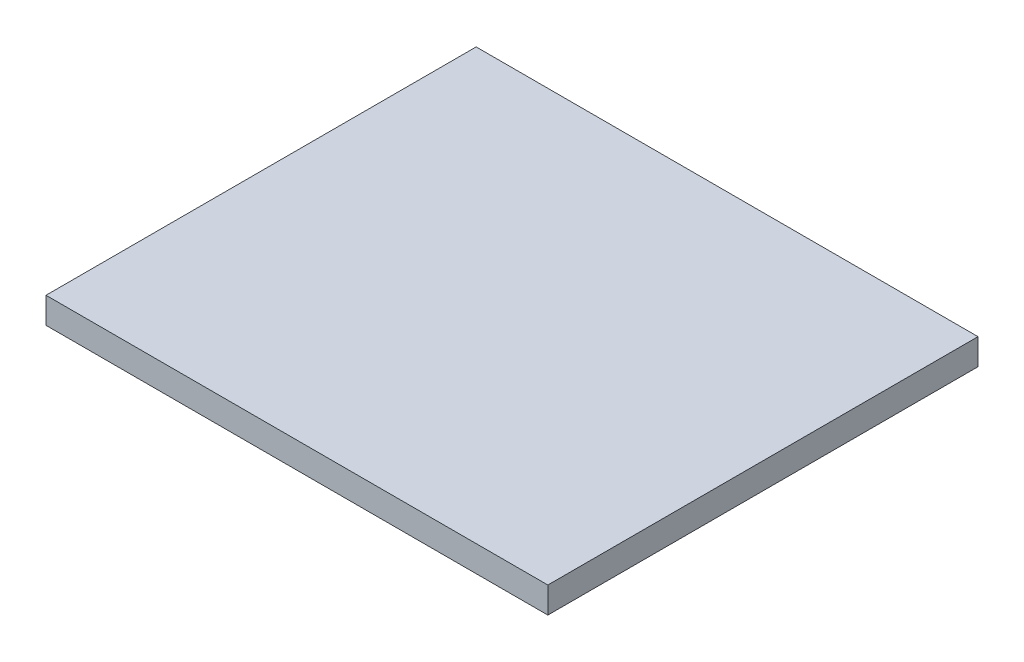
ISO-10303-21;
HEADER;
FILE_DESCRIPTION(('STEP AP214'),'2;1');
FILE_NAME('part.step','',(''),(''),'','','');
FILE_SCHEMA(('AUTOMOTIVE_DESIGN { 1 0 10303 214 1 1 1 1 }'));
ENDSEC;
DATA;
#1=APPLICATION_CONTEXT('core data for automotive mechanical design processes');
#2=APPLICATION_PROTOCOL_DEFINITION('international standard','automotive_design',2000,#1);
#3=PRODUCT_CONTEXT('',#1,'mechanical');
#4=PRODUCT('Part','Part','',(#3));
#5=PRODUCT_RELATED_PRODUCT_CATEGORY('part','',(#4));
#6=PRODUCT_DEFINITION_FORMATION('','',#4);
#7=PRODUCT_DEFINITION_CONTEXT('part definition',#1,'design');
#8=PRODUCT_DEFINITION('design','',#6,#7);
#9=PRODUCT_DEFINITION_SHAPE('','',#8);
#10=(LENGTH_UNIT() NAMED_UNIT(*) SI_UNIT(.MILLI.,.METRE.));
#11=(NAMED_UNIT(*) PLANE_ANGLE_UNIT() SI_UNIT($,.RADIAN.));
#12=(NAMED_UNIT(*) SI_UNIT($,.STERADIAN.) SOLID_ANGLE_UNIT());
#13=UNCERTAINTY_MEASURE_WITH_UNIT(LENGTH_MEASURE(1.E-05),#10,'distance_accuracy_value','');
#14=(GEOMETRIC_REPRESENTATION_CONTEXT(3) GLOBAL_UNCERTAINTY_ASSIGNED_CONTEXT((#13)) GLOBAL_UNIT_ASSIGNED_CONTEXT((#10,
#11,#12)) REPRESENTATION_CONTEXT('',''));
#15=CARTESIAN_POINT('',(0.,0.,0.));
#16=DIRECTION('',(0.,0.,1.));
#17=DIRECTION('',(1.,0.,0.));
#18=AXIS2_PLACEMENT_3D('',#15,#16,#17);
#19=CARTESIAN_POINT('',(19.25,2.,-16.5));
#20=DIRECTION('',(-1.,0.,0.));
#21=DIRECTION('',(0.,0.,1.));
#22=AXIS2_PLACEMENT_3D('',#19,#20,#21);
#23=PLANE('',#22);
#24=DIRECTION('',(0.,0.,-1.));
#25=VECTOR('',#24,1.);
#26=CARTESIAN_POINT('',(19.25,0.,-16.5));
#27=LINE('',#26,#25);
#28=CARTESIAN_POINT('',(19.25,0.,16.5));
#29=VERTEX_POINT('',#28);
#30=CARTESIAN_POINT('',(19.25,0.,-16.5));
#31=VERTEX_POINT('',#30);
#32=EDGE_CURVE('E98',#29,#31,#27,.T.);
#33=ORIENTED_EDGE('',*,*,#32,.T.);
#34=DIRECTION('',(0.,-1.,0.));
#35=VECTOR('',#34,1.);
#36=CARTESIAN_POINT('',(19.25,2.,-16.5));
#37=LINE('',#36,#35);
#38=CARTESIAN_POINT('',(19.25,2.,-16.5));
#39=VERTEX_POINT('',#38);
#40=EDGE_CURVE('E11',#39,#31,#37,.T.);
#41=ORIENTED_EDGE('',*,*,#40,.F.);
#42=DIRECTION('',(0.,0.,-1.));
#43=VECTOR('',#42,1.);
#44=CARTESIAN_POINT('',(19.25,2.,-16.5));
#45=LINE('',#44,#43);
#46=CARTESIAN_POINT('',(19.25,2.,16.5));
#47=VERTEX_POINT('',#46);
#48=EDGE_CURVE('E86',#47,#39,#45,.T.);
#49=ORIENTED_EDGE('',*,*,#48,.F.);
#50=DIRECTION('',(0.,-1.,0.));
#51=VECTOR('',#50,1.);
#52=CARTESIAN_POINT('',(19.25,2.,16.5));
#53=LINE('',#52,#51);
#54=EDGE_CURVE('E94',#47,#29,#53,.T.);
#55=ORIENTED_EDGE('',*,*,#54,.T.);
#56=EDGE_LOOP('',(#33,#41,#49,#55));
#57=FACE_BOUND('',#56,.T.);
#58=ADVANCED_FACE('F35',(#57),#23,.F.);
#59=CARTESIAN_POINT('',(-19.25,2.,-16.5));
#60=DIRECTION('',(0.,0.,1.));
#61=DIRECTION('',(1.,0.,0.));
#62=AXIS2_PLACEMENT_3D('',#59,#60,#61);
#63=PLANE('',#62);
#64=DIRECTION('',(-1.,0.,0.));
#65=VECTOR('',#64,1.);
#66=CARTESIAN_POINT('',(-19.25,0.,-16.5));
#67=LINE('',#66,#65);
#68=CARTESIAN_POINT('',(-19.25,0.,-16.5));
#69=VERTEX_POINT('',#68);
#70=EDGE_CURVE('E90',#31,#69,#67,.T.);
#71=ORIENTED_EDGE('',*,*,#70,.T.);
#72=DIRECTION('',(0.,-1.,0.));
#73=VECTOR('',#72,1.);
#74=CARTESIAN_POINT('',(-19.25,2.,-16.5));
#75=LINE('',#74,#73);
#76=CARTESIAN_POINT('',(-19.25,2.,-16.5));
#77=VERTEX_POINT('',#76);
#78=EDGE_CURVE('E43',#77,#69,#75,.T.);
#79=ORIENTED_EDGE('',*,*,#78,.F.);
#80=DIRECTION('',(-1.,0.,0.));
#81=VECTOR('',#80,1.);
#82=CARTESIAN_POINT('',(-19.25,2.,-16.5));
#83=LINE('',#82,#81);
#84=EDGE_CURVE('E81',#39,#77,#83,.T.);
#85=ORIENTED_EDGE('',*,*,#84,.F.);
#86=ORIENTED_EDGE('',*,*,#40,.T.);
#87=EDGE_LOOP('',(#71,#79,#85,#86));
#88=FACE_BOUND('',#87,.T.);
#89=ADVANCED_FACE('F89',(#88),#63,.F.);
#90=CARTESIAN_POINT('',(-19.25,2.,-16.5));
#91=DIRECTION('',(1.,0.,0.));
#92=DIRECTION('',(0.,0.,-1.));
#93=AXIS2_PLACEMENT_3D('',#90,#91,#92);
#94=PLANE('',#93);
#95=DIRECTION('',(0.,0.,1.));
#96=VECTOR('',#95,1.);
#97=CARTESIAN_POINT('',(-19.25,0.,-16.5));
#98=LINE('',#97,#96);
#99=CARTESIAN_POINT('',(-19.25,0.,16.5));
#100=VERTEX_POINT('',#99);
#101=EDGE_CURVE('E68',#69,#100,#98,.T.);
#102=ORIENTED_EDGE('',*,*,#101,.T.);
#103=DIRECTION('',(0.,-1.,0.));
#104=VECTOR('',#103,1.);
#105=CARTESIAN_POINT('',(-19.25,2.,16.5));
#106=LINE('',#105,#104);
#107=CARTESIAN_POINT('',(-19.25,2.,16.5));
#108=VERTEX_POINT('',#107);
#109=EDGE_CURVE('E91',#108,#100,#106,.T.);
#110=ORIENTED_EDGE('',*,*,#109,.F.);
#111=DIRECTION('',(0.,0.,1.));
#112=VECTOR('',#111,1.);
#113=CARTESIAN_POINT('',(-19.25,2.,-16.5));
#114=LINE('',#113,#112);
#115=EDGE_CURVE('E84',#77,#108,#114,.T.);
#116=ORIENTED_EDGE('',*,*,#115,.F.);
#117=ORIENTED_EDGE('',*,*,#78,.T.);
#118=EDGE_LOOP('',(#102,#110,#116,#117));
#119=FACE_BOUND('',#118,.T.);
#120=ADVANCED_FACE('F92',(#119),#94,.F.);
#121=CARTESIAN_POINT('',(-19.25,2.,16.5));
#122=DIRECTION('',(0.,0.,-1.));
#123=DIRECTION('',(-1.,0.,0.));
#124=AXIS2_PLACEMENT_3D('',#121,#122,#123);
#125=PLANE('',#124);
#126=DIRECTION('',(1.,0.,0.));
#127=VECTOR('',#126,1.);
#128=CARTESIAN_POINT('',(-19.25,0.,16.5));
#129=LINE('',#128,#127);
#130=EDGE_CURVE('E74',#100,#29,#129,.T.);
#131=ORIENTED_EDGE('',*,*,#130,.T.);
#132=ORIENTED_EDGE('',*,*,#54,.F.);
#133=DIRECTION('',(1.,0.,0.));
#134=VECTOR('',#133,1.);
#135=CARTESIAN_POINT('',(-19.25,2.,16.5));
#136=LINE('',#135,#134);
#137=EDGE_CURVE('E51',#108,#47,#136,.T.);
#138=ORIENTED_EDGE('',*,*,#137,.F.);
#139=ORIENTED_EDGE('',*,*,#109,.T.);
#140=EDGE_LOOP('',(#131,#132,#138,#139));
#141=FACE_BOUND('',#140,.T.);
#142=ADVANCED_FACE('F105',(#141),#125,.F.);
#143=CARTESIAN_POINT('',(0.,2.,0.));
#144=DIRECTION('',(0.,1.,0.));
#145=DIRECTION('',(0.,0.,1.));
#146=AXIS2_PLACEMENT_3D('',#143,#144,#145);
#147=PLANE('',#146);
#148=ORIENTED_EDGE('',*,*,#48,.T.);
#149=ORIENTED_EDGE('',*,*,#84,.T.);
#150=ORIENTED_EDGE('',*,*,#115,.T.);
#151=ORIENTED_EDGE('',*,*,#137,.T.);
#152=EDGE_LOOP('',(#148,#149,#150,#151));
#153=FACE_BOUND('',#152,.T.);
#154=ADVANCED_FACE('F82',(#153),#147,.T.);
#155=CARTESIAN_POINT('',(0.,0.,0.));
#156=DIRECTION('',(0.,1.,0.));
#157=DIRECTION('',(0.,0.,1.));
#158=AXIS2_PLACEMENT_3D('',#155,#156,#157);
#159=PLANE('',#158);
#160=ORIENTED_EDGE('',*,*,#32,.F.);
#161=ORIENTED_EDGE('',*,*,#130,.F.);
#162=ORIENTED_EDGE('',*,*,#101,.F.);
#163=ORIENTED_EDGE('',*,*,#70,.F.);
#164=EDGE_LOOP('',(#160,#161,#162,#163));
#165=FACE_BOUND('',#164,.T.);
#166=ADVANCED_FACE('F108',(#165),#159,.F.);
#167=CLOSED_SHELL('',(#58,#89,#120,#142,#154,#166));
#168=MANIFOLD_SOLID_BREP('B2',#167);
#169=ADVANCED_BREP_SHAPE_REPRESENTATION('',(#18,#168),#14);
#170=SHAPE_DEFINITION_REPRESENTATION(#9,#169);
ENDSEC;
END-ISO-10303-21;
